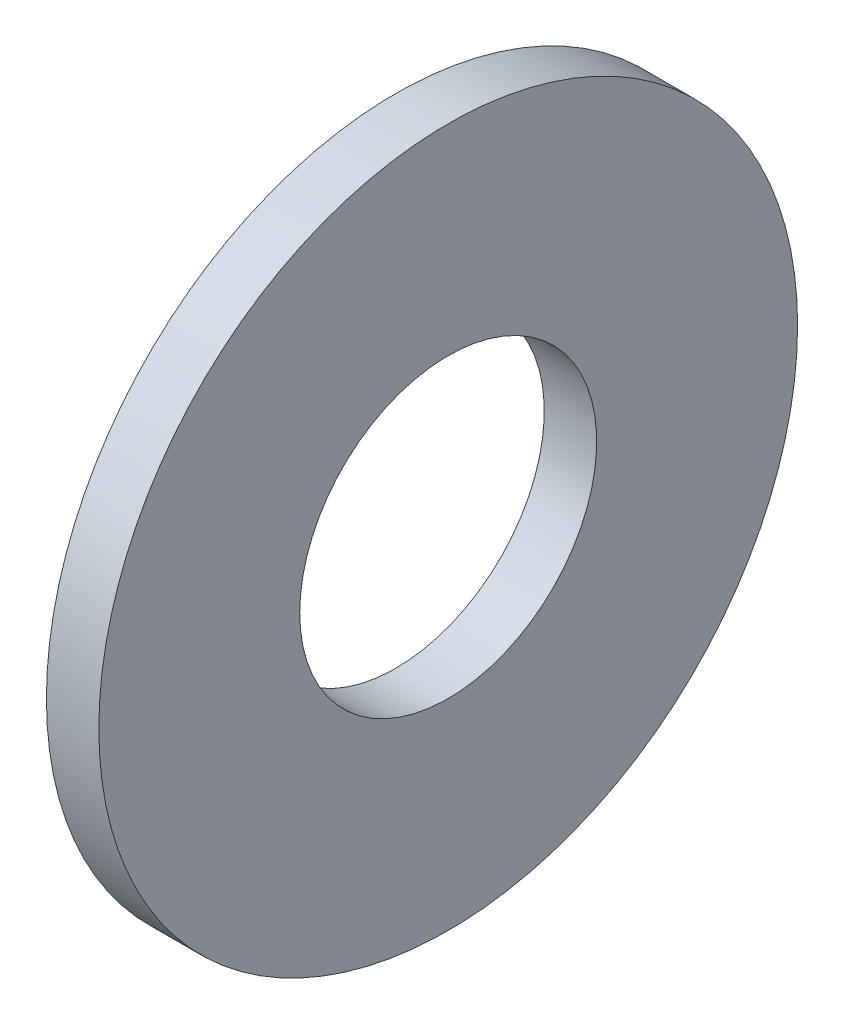
ISO-10303-21;
HEADER;
FILE_DESCRIPTION(('STEP AP214'),'2;1');
FILE_NAME('part.step','',(''),(''),'','','');
FILE_SCHEMA(('AUTOMOTIVE_DESIGN { 1 0 10303 214 1 1 1 1 }'));
ENDSEC;
DATA;
#1=APPLICATION_CONTEXT('core data for automotive mechanical design processes');
#2=APPLICATION_PROTOCOL_DEFINITION('international standard','automotive_design',2000,#1);
#3=PRODUCT_CONTEXT('',#1,'mechanical');
#4=PRODUCT('Part','Part','',(#3));
#5=PRODUCT_RELATED_PRODUCT_CATEGORY('part','',(#4));
#6=PRODUCT_DEFINITION_FORMATION('','',#4);
#7=PRODUCT_DEFINITION_CONTEXT('part definition',#1,'design');
#8=PRODUCT_DEFINITION('design','',#6,#7);
#9=PRODUCT_DEFINITION_SHAPE('','',#8);
#10=(LENGTH_UNIT() NAMED_UNIT(*) SI_UNIT(.MILLI.,.METRE.));
#11=(NAMED_UNIT(*) PLANE_ANGLE_UNIT() SI_UNIT($,.RADIAN.));
#12=(NAMED_UNIT(*) SI_UNIT($,.STERADIAN.) SOLID_ANGLE_UNIT());
#13=UNCERTAINTY_MEASURE_WITH_UNIT(LENGTH_MEASURE(1.E-05),#10,'distance_accuracy_value','');
#14=(GEOMETRIC_REPRESENTATION_CONTEXT(3) GLOBAL_UNCERTAINTY_ASSIGNED_CONTEXT((#13)) GLOBAL_UNIT_ASSIGNED_CONTEXT((#10,
#11,#12)) REPRESENTATION_CONTEXT('',''));
#15=CARTESIAN_POINT('',(0.,0.,0.));
#16=DIRECTION('',(0.,0.,1.));
#17=DIRECTION('',(1.,0.,0.));
#18=AXIS2_PLACEMENT_3D('',#15,#16,#17);
#19=CARTESIAN_POINT('',(-34.9249999999999,0.,0.));
#20=DIRECTION('',(-1.,0.,0.));
#21=DIRECTION('',(0.,0.,1.));
#22=AXIS2_PLACEMENT_3D('',#19,#20,#21);
#23=CYLINDRICAL_SURFACE('',#22,0.850000000000004);
#24=CARTESIAN_POINT('',(0.,0.,0.));
#25=DIRECTION('',(-1.,0.,0.));
#26=DIRECTION('',(0.,0.,1.));
#27=AXIS2_PLACEMENT_3D('',#24,#25,#26);
#28=CIRCLE('',#27,0.850000000000004);
#29=CARTESIAN_POINT('',(0.,0.,0.850000000000004));
#30=VERTEX_POINT('',#29);
#31=EDGE_CURVE('E10',#30,#30,#28,.T.);
#32=ORIENTED_EDGE('',*,*,#31,.F.);
#33=EDGE_LOOP('',(#32));
#34=FACE_BOUND('',#33,.T.);
#35=CARTESIAN_POINT('',(-0.300000000000002,0.,0.));
#36=DIRECTION('',(-1.,0.,0.));
#37=DIRECTION('',(0.,0.,1.));
#38=AXIS2_PLACEMENT_3D('',#35,#36,#37);
#39=CIRCLE('',#38,0.850000000000004);
#40=CARTESIAN_POINT('',(-0.300000000000002,0.,0.850000000000004));
#41=VERTEX_POINT('',#40);
#42=EDGE_CURVE('E46',#41,#41,#39,.T.);
#43=ORIENTED_EDGE('',*,*,#42,.T.);
#44=EDGE_LOOP('',(#43));
#45=FACE_BOUND('',#44,.T.);
#46=ADVANCED_FACE('F32',(#34,#45),#23,.F.);
#47=CARTESIAN_POINT('',(0.,0.850000000000004,0.));
#48=DIRECTION('',(-1.,0.,0.));
#49=DIRECTION('',(0.,0.,1.));
#50=AXIS2_PLACEMENT_3D('',#47,#48,#49);
#51=PLANE('',#50);
#52=CARTESIAN_POINT('',(0.,0.,0.));
#53=DIRECTION('',(-1.,0.,0.));
#54=DIRECTION('',(0.,0.,1.));
#55=AXIS2_PLACEMENT_3D('',#52,#53,#54);
#56=CIRCLE('',#55,2.);
#57=CARTESIAN_POINT('',(0.,0.,2.));
#58=VERTEX_POINT('',#57);
#59=EDGE_CURVE('E38',#58,#58,#56,.T.);
#60=ORIENTED_EDGE('',*,*,#59,.F.);
#61=EDGE_LOOP('',(#60));
#62=FACE_BOUND('',#61,.T.);
#63=ORIENTED_EDGE('',*,*,#31,.T.);
#64=EDGE_LOOP('',(#63));
#65=FACE_BOUND('',#64,.T.);
#66=ADVANCED_FACE('F61',(#62,#65),#51,.F.);
#67=CARTESIAN_POINT('',(-34.9249999999999,0.,0.));
#68=DIRECTION('',(-1.,0.,0.));
#69=DIRECTION('',(0.,0.,1.));
#70=AXIS2_PLACEMENT_3D('',#67,#68,#69);
#71=CYLINDRICAL_SURFACE('',#70,2.);
#72=CARTESIAN_POINT('',(-0.300000000000002,0.,0.));
#73=DIRECTION('',(-1.,0.,0.));
#74=DIRECTION('',(0.,0.,1.));
#75=AXIS2_PLACEMENT_3D('',#72,#73,#74);
#76=CIRCLE('',#75,2.);
#77=CARTESIAN_POINT('',(-0.300000000000002,0.,2.));
#78=VERTEX_POINT('',#77);
#79=EDGE_CURVE('E42',#78,#78,#76,.T.);
#80=ORIENTED_EDGE('',*,*,#79,.F.);
#81=EDGE_LOOP('',(#80));
#82=FACE_BOUND('',#81,.T.);
#83=ORIENTED_EDGE('',*,*,#59,.T.);
#84=EDGE_LOOP('',(#83));
#85=FACE_BOUND('',#84,.T.);
#86=ADVANCED_FACE('F56',(#82,#85),#71,.T.);
#87=CARTESIAN_POINT('',(-0.300000000000002,2.,0.));
#88=DIRECTION('',(1.,0.,0.));
#89=DIRECTION('',(0.,0.,-1.));
#90=AXIS2_PLACEMENT_3D('',#87,#88,#89);
#91=PLANE('',#90);
#92=ORIENTED_EDGE('',*,*,#42,.F.);
#93=EDGE_LOOP('',(#92));
#94=FACE_BOUND('',#93,.T.);
#95=ORIENTED_EDGE('',*,*,#79,.T.);
#96=EDGE_LOOP('',(#95));
#97=FACE_BOUND('',#96,.T.);
#98=ADVANCED_FACE('F53',(#94,#97),#91,.F.);
#99=CLOSED_SHELL('',(#46,#66,#86,#98));
#100=MANIFOLD_SOLID_BREP('B2',#99);
#101=ADVANCED_BREP_SHAPE_REPRESENTATION('',(#18,#100),#14);
#102=SHAPE_DEFINITION_REPRESENTATION(#9,#101);
ENDSEC;
END-ISO-10303-21;
